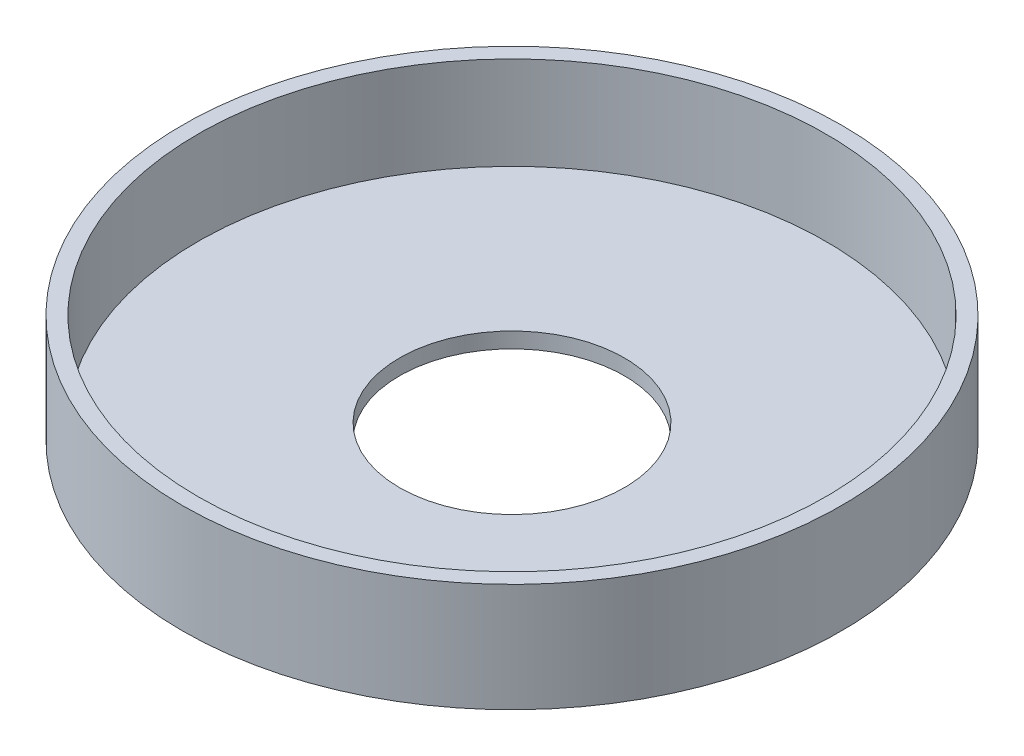
ISO-10303-21;
HEADER;
FILE_DESCRIPTION(('STEP AP214'),'2;1');
FILE_NAME('part.step','',(''),(''),'','','');
FILE_SCHEMA(('AUTOMOTIVE_DESIGN { 1 0 10303 214 1 1 1 1 }'));
ENDSEC;
DATA;
#1=APPLICATION_CONTEXT('core data for automotive mechanical design processes');
#2=APPLICATION_PROTOCOL_DEFINITION('international standard','automotive_design',2000,#1);
#3=PRODUCT_CONTEXT('',#1,'mechanical');
#4=PRODUCT('Part','Part','',(#3));
#5=PRODUCT_RELATED_PRODUCT_CATEGORY('part','',(#4));
#6=PRODUCT_DEFINITION_FORMATION('','',#4);
#7=PRODUCT_DEFINITION_CONTEXT('part definition',#1,'design');
#8=PRODUCT_DEFINITION('design','',#6,#7);
#9=PRODUCT_DEFINITION_SHAPE('','',#8);
#10=(LENGTH_UNIT() NAMED_UNIT(*) SI_UNIT(.MILLI.,.METRE.));
#11=(NAMED_UNIT(*) PLANE_ANGLE_UNIT() SI_UNIT($,.RADIAN.));
#12=(NAMED_UNIT(*) SI_UNIT($,.STERADIAN.) SOLID_ANGLE_UNIT());
#13=UNCERTAINTY_MEASURE_WITH_UNIT(LENGTH_MEASURE(1.E-05),#10,'distance_accuracy_value','');
#14=(GEOMETRIC_REPRESENTATION_CONTEXT(3) GLOBAL_UNCERTAINTY_ASSIGNED_CONTEXT((#13)) GLOBAL_UNIT_ASSIGNED_CONTEXT((#10,
#11,#12)) REPRESENTATION_CONTEXT('',''));
#15=CARTESIAN_POINT('',(0.,0.,0.));
#16=DIRECTION('',(0.,0.,1.));
#17=DIRECTION('',(1.,0.,0.));
#18=AXIS2_PLACEMENT_3D('',#15,#16,#17);
#19=CARTESIAN_POINT('',(0.,2.,0.));
#20=DIRECTION('',(0.,1.,0.));
#21=DIRECTION('',(0.,0.,1.));
#22=AXIS2_PLACEMENT_3D('',#19,#20,#21);
#23=PLANE('',#22);
#24=CARTESIAN_POINT('',(0.,2.,0.));
#25=DIRECTION('',(0.,1.,0.));
#26=DIRECTION('',(0.,0.,1.));
#27=AXIS2_PLACEMENT_3D('',#24,#25,#26);
#28=CIRCLE('',#27,14.5);
#29=CARTESIAN_POINT('',(0.,2.,14.5));
#30=VERTEX_POINT('',#29);
#31=EDGE_CURVE('E46',#30,#30,#28,.T.);
#32=ORIENTED_EDGE('',*,*,#31,.F.);
#33=EDGE_LOOP('',(#32));
#34=FACE_BOUND('',#33,.T.);
#35=CARTESIAN_POINT('',(0.,2.,0.));
#36=DIRECTION('',(0.,1.,0.));
#37=DIRECTION('',(0.,0.,1.));
#38=AXIS2_PLACEMENT_3D('',#35,#36,#37);
#39=CIRCLE('',#38,40.5);
#40=CARTESIAN_POINT('',(0.,2.,40.5));
#41=VERTEX_POINT('',#40);
#42=EDGE_CURVE('E10',#41,#41,#39,.F.);
#43=ORIENTED_EDGE('',*,*,#42,.F.);
#44=EDGE_LOOP('',(#43));
#45=FACE_BOUND('',#44,.T.);
#46=ADVANCED_FACE('F35',(#34,#45),#23,.T.);
#47=CARTESIAN_POINT('',(0.,0.,0.));
#48=DIRECTION('',(0.,1.,0.));
#49=DIRECTION('',(0.,0.,1.));
#50=AXIS2_PLACEMENT_3D('',#47,#48,#49);
#51=PLANE('',#50);
#52=CARTESIAN_POINT('',(0.,0.,0.));
#53=DIRECTION('',(0.,1.,0.));
#54=DIRECTION('',(0.,0.,1.));
#55=AXIS2_PLACEMENT_3D('',#52,#53,#54);
#56=CIRCLE('',#55,42.5);
#57=CARTESIAN_POINT('',(0.,0.,42.5));
#58=VERTEX_POINT('',#57);
#59=EDGE_CURVE('E42',#58,#58,#56,.T.);
#60=ORIENTED_EDGE('',*,*,#59,.F.);
#61=EDGE_LOOP('',(#60));
#62=FACE_BOUND('',#61,.T.);
#63=CARTESIAN_POINT('',(0.,0.,0.));
#64=DIRECTION('',(0.,1.,0.));
#65=DIRECTION('',(0.,0.,1.));
#66=AXIS2_PLACEMENT_3D('',#63,#64,#65);
#67=CIRCLE('',#66,14.5);
#68=CARTESIAN_POINT('',(0.,0.,14.5));
#69=VERTEX_POINT('',#68);
#70=EDGE_CURVE('E50',#69,#69,#67,.T.);
#71=ORIENTED_EDGE('',*,*,#70,.T.);
#72=EDGE_LOOP('',(#71));
#73=FACE_BOUND('',#72,.T.);
#74=ADVANCED_FACE('F77',(#62,#73),#51,.F.);
#75=CARTESIAN_POINT('',(0.,2.,0.));
#76=DIRECTION('',(0.,-1.,0.));
#77=DIRECTION('',(0.,0.,-1.));
#78=AXIS2_PLACEMENT_3D('',#75,#76,#77);
#79=CYLINDRICAL_SURFACE('',#78,42.5);
#80=ORIENTED_EDGE('',*,*,#59,.T.);
#81=EDGE_LOOP('',(#80));
#82=FACE_BOUND('',#81,.T.);
#83=CARTESIAN_POINT('',(0.,14.,0.));
#84=DIRECTION('',(0.,1.,0.));
#85=DIRECTION('',(0.,0.,1.));
#86=AXIS2_PLACEMENT_3D('',#83,#84,#85);
#87=CIRCLE('',#86,42.5);
#88=CARTESIAN_POINT('',(0.,14.,42.5));
#89=VERTEX_POINT('',#88);
#90=EDGE_CURVE('E54',#89,#89,#87,.T.);
#91=ORIENTED_EDGE('',*,*,#90,.F.);
#92=EDGE_LOOP('',(#91));
#93=FACE_BOUND('',#92,.T.);
#94=ADVANCED_FACE('F37',(#82,#93),#79,.T.);
#95=CARTESIAN_POINT('',(0.,2.,0.));
#96=DIRECTION('',(0.,-1.,0.));
#97=DIRECTION('',(0.,0.,-1.));
#98=AXIS2_PLACEMENT_3D('',#95,#96,#97);
#99=CYLINDRICAL_SURFACE('',#98,14.5);
#100=ORIENTED_EDGE('',*,*,#31,.T.);
#101=EDGE_LOOP('',(#100));
#102=FACE_BOUND('',#101,.T.);
#103=ORIENTED_EDGE('',*,*,#70,.F.);
#104=EDGE_LOOP('',(#103));
#105=FACE_BOUND('',#104,.T.);
#106=ADVANCED_FACE('F66',(#102,#105),#99,.F.);
#107=CARTESIAN_POINT('',(0.,14.,0.));
#108=DIRECTION('',(0.,1.,0.));
#109=DIRECTION('',(0.,0.,1.));
#110=AXIS2_PLACEMENT_3D('',#107,#108,#109);
#111=PLANE('',#110);
#112=ORIENTED_EDGE('',*,*,#90,.T.);
#113=EDGE_LOOP('',(#112));
#114=FACE_BOUND('',#113,.T.);
#115=CARTESIAN_POINT('',(0.,14.,0.));
#116=DIRECTION('',(0.,1.,0.));
#117=DIRECTION('',(0.,0.,1.));
#118=AXIS2_PLACEMENT_3D('',#115,#116,#117);
#119=CIRCLE('',#118,40.5);
#120=CARTESIAN_POINT('',(0.,14.,40.5));
#121=VERTEX_POINT('',#120);
#122=EDGE_CURVE('E58',#121,#121,#119,.T.);
#123=ORIENTED_EDGE('',*,*,#122,.F.);
#124=EDGE_LOOP('',(#123));
#125=FACE_BOUND('',#124,.T.);
#126=ADVANCED_FACE('F64',(#114,#125),#111,.T.);
#127=CARTESIAN_POINT('',(0.,14.,0.));
#128=DIRECTION('',(0.,-1.,0.));
#129=DIRECTION('',(0.,0.,-1.));
#130=AXIS2_PLACEMENT_3D('',#127,#128,#129);
#131=CYLINDRICAL_SURFACE('',#130,40.5);
#132=ORIENTED_EDGE('',*,*,#122,.T.);
#133=EDGE_LOOP('',(#132));
#134=FACE_BOUND('',#133,.T.);
#135=ORIENTED_EDGE('',*,*,#42,.T.);
#136=EDGE_LOOP('',(#135));
#137=FACE_BOUND('',#136,.T.);
#138=ADVANCED_FACE('F62',(#134,#137),#131,.F.);
#139=CLOSED_SHELL('',(#46,#74,#94,#106,#126,#138));
#140=MANIFOLD_SOLID_BREP('B2',#139);
#141=ADVANCED_BREP_SHAPE_REPRESENTATION('',(#18,#140),#14);
#142=SHAPE_DEFINITION_REPRESENTATION(#9,#141);
ENDSEC;
END-ISO-10303-21;
